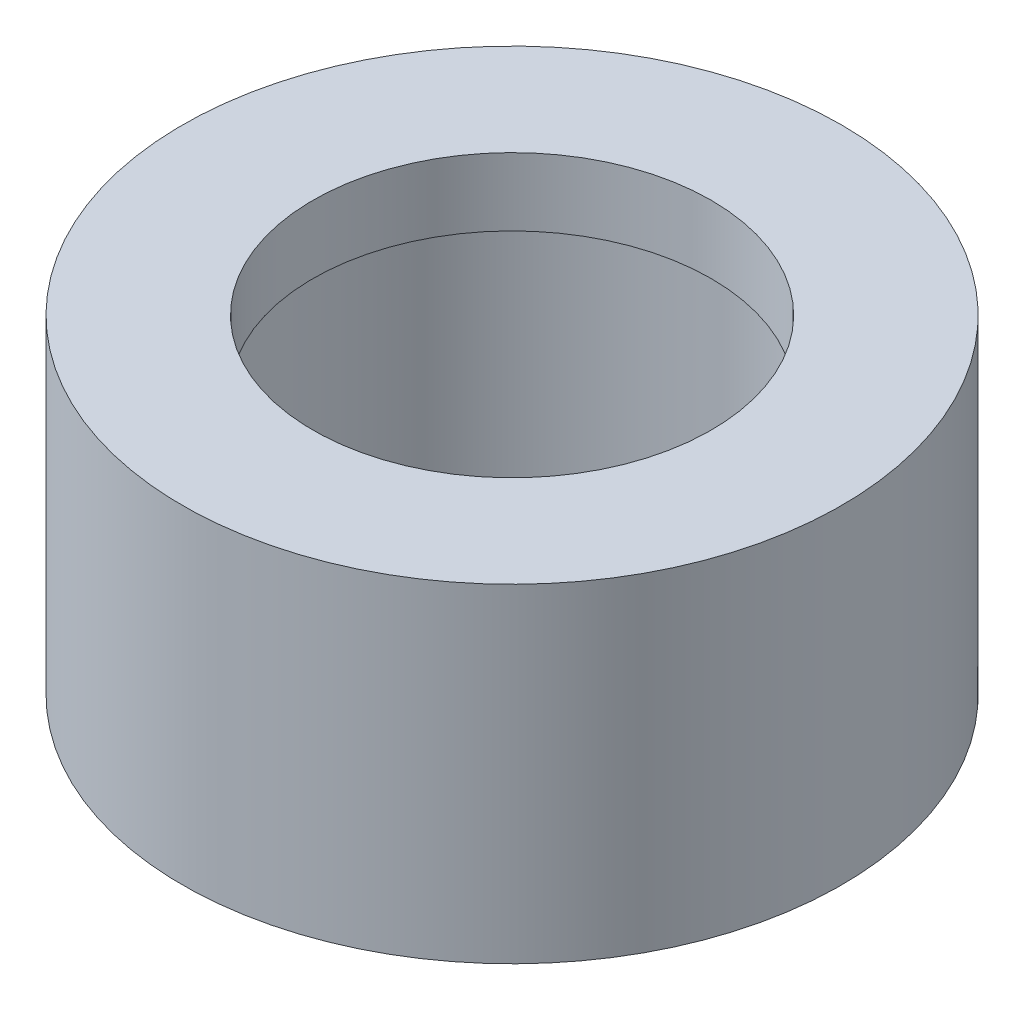
ISO-10303-21;
HEADER;
FILE_DESCRIPTION(('STEP AP214'),'2;1');
FILE_NAME('part.step','',(''),(''),'','','');
FILE_SCHEMA(('AUTOMOTIVE_DESIGN { 1 0 10303 214 1 1 1 1 }'));
ENDSEC;
DATA;
#1=APPLICATION_CONTEXT('core data for automotive mechanical design processes');
#2=APPLICATION_PROTOCOL_DEFINITION('international standard','automotive_design',2000,#1);
#3=PRODUCT_CONTEXT('',#1,'mechanical');
#4=PRODUCT('Part','Part','',(#3));
#5=PRODUCT_RELATED_PRODUCT_CATEGORY('part','',(#4));
#6=PRODUCT_DEFINITION_FORMATION('','',#4);
#7=PRODUCT_DEFINITION_CONTEXT('part definition',#1,'design');
#8=PRODUCT_DEFINITION('design','',#6,#7);
#9=PRODUCT_DEFINITION_SHAPE('','',#8);
#10=(LENGTH_UNIT() NAMED_UNIT(*) SI_UNIT(.MILLI.,.METRE.));
#11=(NAMED_UNIT(*) PLANE_ANGLE_UNIT() SI_UNIT($,.RADIAN.));
#12=(NAMED_UNIT(*) SI_UNIT($,.STERADIAN.) SOLID_ANGLE_UNIT());
#13=UNCERTAINTY_MEASURE_WITH_UNIT(LENGTH_MEASURE(1.E-05),#10,'distance_accuracy_value','');
#14=(GEOMETRIC_REPRESENTATION_CONTEXT(3) GLOBAL_UNCERTAINTY_ASSIGNED_CONTEXT((#13)) GLOBAL_UNIT_ASSIGNED_CONTEXT((#10,
#11,#12)) REPRESENTATION_CONTEXT('',''));
#15=CARTESIAN_POINT('',(0.,0.,0.));
#16=DIRECTION('',(0.,0.,1.));
#17=DIRECTION('',(1.,0.,0.));
#18=AXIS2_PLACEMENT_3D('',#15,#16,#17);
#19=CARTESIAN_POINT('',(0.,0.,-11.2825244284643));
#20=DIRECTION('',(0.,-1.,0.));
#21=DIRECTION('',(0.,0.,-1.));
#22=AXIS2_PLACEMENT_3D('',#19,#20,#21);
#23=PLANE('',#22);
#24=CARTESIAN_POINT('',(0.,0.,0.));
#25=DIRECTION('',(0.,-1.,0.));
#26=DIRECTION('',(0.,0.,-1.));
#27=AXIS2_PLACEMENT_3D('',#24,#25,#26);
#28=CIRCLE('',#27,11.2825244284643);
#29=CARTESIAN_POINT('',(0.,0.,-11.2825244284643));
#30=VERTEX_POINT('',#29);
#31=EDGE_CURVE('E53',#30,#30,#28,.T.);
#32=ORIENTED_EDGE('',*,*,#31,.T.);
#33=EDGE_LOOP('',(#32));
#34=FACE_BOUND('',#33,.T.);
#35=CARTESIAN_POINT('',(0.,0.,0.));
#36=DIRECTION('',(0.,-1.,0.));
#37=DIRECTION('',(0.,0.,-1.));
#38=AXIS2_PLACEMENT_3D('',#35,#36,#37);
#39=CIRCLE('',#38,9.6950244284643);
#40=CARTESIAN_POINT('',(0.,0.,-9.6950244284643));
#41=VERTEX_POINT('',#40);
#42=EDGE_CURVE('E10',#41,#41,#39,.T.);
#43=ORIENTED_EDGE('',*,*,#42,.F.);
#44=EDGE_LOOP('',(#43));
#45=FACE_BOUND('',#44,.T.);
#46=ADVANCED_FACE('F31',(#34,#45),#23,.T.);
#47=CARTESIAN_POINT('',(0.,0.,0.));
#48=DIRECTION('',(0.,-1.,0.));
#49=DIRECTION('',(0.,0.,-1.));
#50=AXIS2_PLACEMENT_3D('',#47,#48,#49);
#51=CYLINDRICAL_SURFACE('',#50,9.6950244284643);
#52=ORIENTED_EDGE('',*,*,#42,.T.);
#53=EDGE_LOOP('',(#52));
#54=FACE_BOUND('',#53,.T.);
#55=CARTESIAN_POINT('',(0.,3.302,0.));
#56=DIRECTION('',(0.,-1.,0.));
#57=DIRECTION('',(0.,0.,-1.));
#58=AXIS2_PLACEMENT_3D('',#55,#56,#57);
#59=CIRCLE('',#58,9.6950244284643);
#60=CARTESIAN_POINT('',(0.,3.302,-9.6950244284643));
#61=VERTEX_POINT('',#60);
#62=EDGE_CURVE('E37',#61,#61,#59,.T.);
#63=ORIENTED_EDGE('',*,*,#62,.F.);
#64=EDGE_LOOP('',(#63));
#65=FACE_BOUND('',#64,.T.);
#66=ADVANCED_FACE('F71',(#54,#65),#51,.F.);
#67=CARTESIAN_POINT('',(0.,3.302,-9.6950244284643));
#68=DIRECTION('',(0.,1.,0.));
#69=DIRECTION('',(0.,0.,1.));
#70=AXIS2_PLACEMENT_3D('',#67,#68,#69);
#71=PLANE('',#70);
#72=ORIENTED_EDGE('',*,*,#62,.T.);
#73=EDGE_LOOP('',(#72));
#74=FACE_BOUND('',#73,.T.);
#75=CARTESIAN_POINT('',(0.,3.302,0.));
#76=DIRECTION('',(0.,-1.,0.));
#77=DIRECTION('',(0.,0.,-1.));
#78=AXIS2_PLACEMENT_3D('',#75,#76,#77);
#79=CIRCLE('',#78,16.0450244284643);
#80=CARTESIAN_POINT('',(0.,3.302,-16.0450244284643));
#81=VERTEX_POINT('',#80);
#82=EDGE_CURVE('E41',#81,#81,#79,.T.);
#83=ORIENTED_EDGE('',*,*,#82,.F.);
#84=EDGE_LOOP('',(#83));
#85=FACE_BOUND('',#84,.T.);
#86=ADVANCED_FACE('F75',(#74,#85),#71,.T.);
#87=CARTESIAN_POINT('',(0.,0.,0.));
#88=DIRECTION('',(0.,-1.,0.));
#89=DIRECTION('',(0.,0.,-1.));
#90=AXIS2_PLACEMENT_3D('',#87,#88,#89);
#91=CYLINDRICAL_SURFACE('',#90,16.0450244284643);
#92=ORIENTED_EDGE('',*,*,#82,.T.);
#93=EDGE_LOOP('',(#92));
#94=FACE_BOUND('',#93,.T.);
#95=CARTESIAN_POINT('',(0.,-12.7,0.));
#96=DIRECTION('',(0.,-1.,0.));
#97=DIRECTION('',(0.,0.,-1.));
#98=AXIS2_PLACEMENT_3D('',#95,#96,#97);
#99=CIRCLE('',#98,16.0450244284643);
#100=CARTESIAN_POINT('',(0.,-12.7,-16.0450244284643));
#101=VERTEX_POINT('',#100);
#102=EDGE_CURVE('E45',#101,#101,#99,.T.);
#103=ORIENTED_EDGE('',*,*,#102,.F.);
#104=EDGE_LOOP('',(#103));
#105=FACE_BOUND('',#104,.T.);
#106=ADVANCED_FACE('F67',(#94,#105),#91,.T.);
#107=CARTESIAN_POINT('',(0.,-12.7,-16.0450244284643));
#108=DIRECTION('',(0.,-1.,0.));
#109=DIRECTION('',(0.,0.,-1.));
#110=AXIS2_PLACEMENT_3D('',#107,#108,#109);
#111=PLANE('',#110);
#112=ORIENTED_EDGE('',*,*,#102,.T.);
#113=EDGE_LOOP('',(#112));
#114=FACE_BOUND('',#113,.T.);
#115=CARTESIAN_POINT('',(0.,-12.7,0.));
#116=DIRECTION('',(0.,-1.,0.));
#117=DIRECTION('',(0.,0.,-1.));
#118=AXIS2_PLACEMENT_3D('',#115,#116,#117);
#119=CIRCLE('',#118,11.2825244284643);
#120=CARTESIAN_POINT('',(0.,-12.7,-11.2825244284643));
#121=VERTEX_POINT('',#120);
#122=EDGE_CURVE('E50',#121,#121,#119,.T.);
#123=ORIENTED_EDGE('',*,*,#122,.F.);
#124=EDGE_LOOP('',(#123));
#125=FACE_BOUND('',#124,.T.);
#126=ADVANCED_FACE('F61',(#114,#125),#111,.T.);
#127=CARTESIAN_POINT('',(0.,0.,0.));
#128=DIRECTION('',(0.,-1.,0.));
#129=DIRECTION('',(0.,0.,-1.));
#130=AXIS2_PLACEMENT_3D('',#127,#128,#129);
#131=CYLINDRICAL_SURFACE('',#130,11.2825244284643);
#132=ORIENTED_EDGE('',*,*,#122,.T.);
#133=EDGE_LOOP('',(#132));
#134=FACE_BOUND('',#133,.T.);
#135=ORIENTED_EDGE('',*,*,#31,.F.);
#136=EDGE_LOOP('',(#135));
#137=FACE_BOUND('',#136,.T.);
#138=ADVANCED_FACE('F59',(#134,#137),#131,.F.);
#139=CLOSED_SHELL('',(#46,#66,#86,#106,#126,#138));
#140=MANIFOLD_SOLID_BREP('B2',#139);
#141=ADVANCED_BREP_SHAPE_REPRESENTATION('',(#18,#140),#14);
#142=SHAPE_DEFINITION_REPRESENTATION(#9,#141);
ENDSEC;
END-ISO-10303-21;
